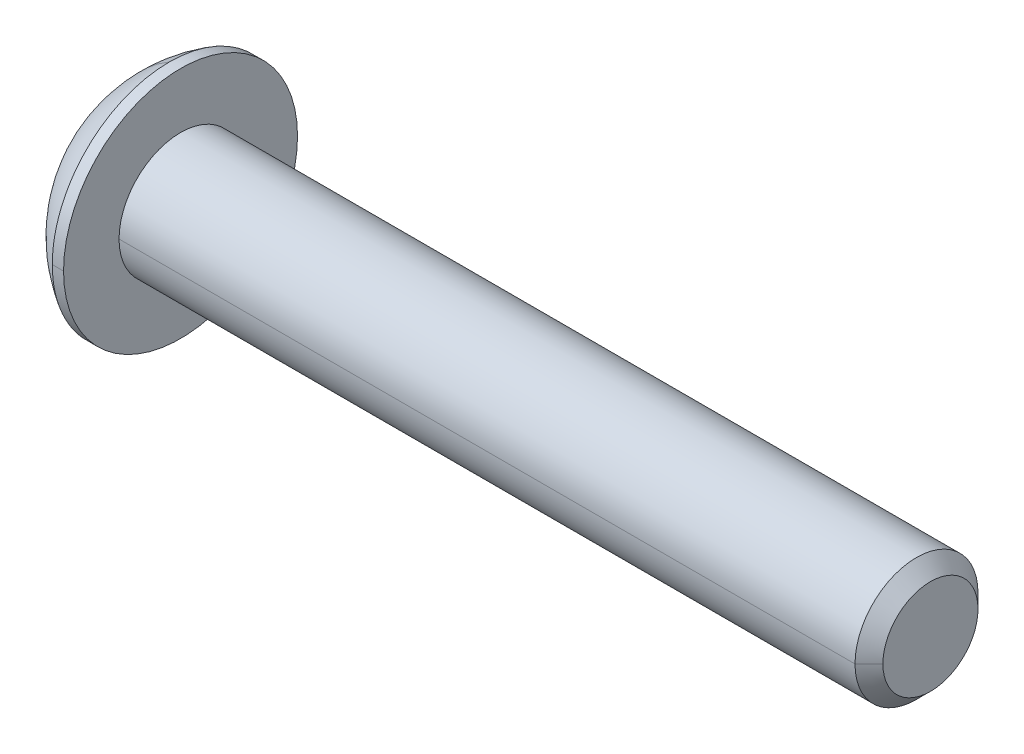
ISO-10303-21;
HEADER;
FILE_DESCRIPTION(('STEP AP214'),'2;1');
FILE_NAME('part.step','',(''),(''),'','','');
FILE_SCHEMA(('AUTOMOTIVE_DESIGN { 1 0 10303 214 1 1 1 1 }'));
ENDSEC;
DATA;
#1=APPLICATION_CONTEXT('core data for automotive mechanical design processes');
#2=APPLICATION_PROTOCOL_DEFINITION('international standard','automotive_design',2000,#1);
#3=PRODUCT_CONTEXT('',#1,'mechanical');
#4=PRODUCT('Part','Part','',(#3));
#5=PRODUCT_RELATED_PRODUCT_CATEGORY('part','',(#4));
#6=PRODUCT_DEFINITION_FORMATION('','',#4);
#7=PRODUCT_DEFINITION_CONTEXT('part definition',#1,'design');
#8=PRODUCT_DEFINITION('design','',#6,#7);
#9=PRODUCT_DEFINITION_SHAPE('','',#8);
#10=(LENGTH_UNIT() NAMED_UNIT(*) SI_UNIT(.MILLI.,.METRE.));
#11=(NAMED_UNIT(*) PLANE_ANGLE_UNIT() SI_UNIT($,.RADIAN.));
#12=(NAMED_UNIT(*) SI_UNIT($,.STERADIAN.) SOLID_ANGLE_UNIT());
#13=UNCERTAINTY_MEASURE_WITH_UNIT(LENGTH_MEASURE(1.E-05),#10,'distance_accuracy_value','');
#14=(GEOMETRIC_REPRESENTATION_CONTEXT(3) GLOBAL_UNCERTAINTY_ASSIGNED_CONTEXT((#13)) GLOBAL_UNIT_ASSIGNED_CONTEXT((#10,
#11,#12)) REPRESENTATION_CONTEXT('',''));
#15=CARTESIAN_POINT('',(0.,0.,0.));
#16=DIRECTION('',(0.,0.,1.));
#17=DIRECTION('',(1.,0.,0.));
#18=AXIS2_PLACEMENT_3D('',#15,#16,#17);
#19=CARTESIAN_POINT('',(-997.989959248641,0.,0.));
#20=DIRECTION('',(-1.,0.,0.));
#21=DIRECTION('',(0.,0.,1.));
#22=AXIS2_PLACEMENT_3D('',#19,#20,#21);
#23=CONICAL_SURFACE('',#22,1732.05080756886,1.0471975511966);
#24=DIRECTION('',(-0.5,0.,0.866025403784436));
#25=VECTOR('',#24,1.);
#26=CARTESIAN_POINT('',(2.01004075135859,0.,0.));
#27=LINE('',#26,#25);
#28=CARTESIAN_POINT('',(2.01004075135859,0.,0.));
#29=VERTEX_POINT('',#28);
#30=CARTESIAN_POINT('',(1.3208,0.,1.1938));
#31=VERTEX_POINT('',#30);
#32=EDGE_CURVE('E11',#29,#31,#27,.T.);
#33=ORIENTED_EDGE('',*,*,#32,.F.);
#34=DIRECTION('',(-0.5,0.,-0.866025403784436));
#35=VECTOR('',#34,1.);
#36=CARTESIAN_POINT('',(2.01004075135859,0.,0.));
#37=LINE('',#36,#35);
#38=CARTESIAN_POINT('',(1.3208,0.,-1.1938));
#39=VERTEX_POINT('',#38);
#40=EDGE_CURVE('E27',#29,#39,#37,.T.);
#41=ORIENTED_EDGE('',*,*,#40,.T.);
#42=CARTESIAN_POINT('',(1.3208,0.,0.));
#43=DIRECTION('',(-1.,0.,0.));
#44=DIRECTION('',(0.,0.,1.));
#45=AXIS2_PLACEMENT_3D('',#42,#43,#44);
#46=CIRCLE('',#45,1.1938);
#47=CARTESIAN_POINT('',(1.3208,-1.03386112703786,-0.5969));
#48=VERTEX_POINT('',#47);
#49=EDGE_CURVE('E303',#39,#48,#46,.T.);
#50=ORIENTED_EDGE('',*,*,#49,.T.);
#51=CARTESIAN_POINT('',(1.3208,0.,0.));
#52=DIRECTION('',(-1.,0.,0.));
#53=DIRECTION('',(0.,0.,1.));
#54=AXIS2_PLACEMENT_3D('',#51,#52,#53);
#55=CIRCLE('',#54,1.1938);
#56=CARTESIAN_POINT('',(1.3208,-1.03386112703786,0.5969));
#57=VERTEX_POINT('',#56);
#58=EDGE_CURVE('E206',#48,#57,#55,.T.);
#59=ORIENTED_EDGE('',*,*,#58,.T.);
#60=CARTESIAN_POINT('',(1.3208,0.,0.));
#61=DIRECTION('',(-1.,0.,0.));
#62=DIRECTION('',(0.,0.,1.));
#63=AXIS2_PLACEMENT_3D('',#60,#61,#62);
#64=CIRCLE('',#63,1.1938);
#65=EDGE_CURVE('E238',#57,#31,#64,.T.);
#66=ORIENTED_EDGE('',*,*,#65,.T.);
#67=EDGE_LOOP('',(#33,#41,#50,#59,#66));
#68=FACE_BOUND('',#67,.T.);
#69=ADVANCED_FACE('F16',(#68),#23,.F.);
#70=CARTESIAN_POINT('',(-997.989959248641,0.,0.));
#71=DIRECTION('',(-1.,0.,0.));
#72=DIRECTION('',(0.,0.,1.));
#73=AXIS2_PLACEMENT_3D('',#70,#71,#72);
#74=CONICAL_SURFACE('',#73,1732.05080756886,1.0471975511966);
#75=ORIENTED_EDGE('',*,*,#40,.F.);
#76=ORIENTED_EDGE('',*,*,#32,.T.);
#77=CARTESIAN_POINT('',(1.3208,0.,0.));
#78=DIRECTION('',(-1.,0.,0.));
#79=DIRECTION('',(0.,0.,1.));
#80=AXIS2_PLACEMENT_3D('',#77,#78,#79);
#81=CIRCLE('',#80,1.1938);
#82=CARTESIAN_POINT('',(1.3208,1.03386112703786,0.5969));
#83=VERTEX_POINT('',#82);
#84=EDGE_CURVE('E100',#31,#83,#81,.T.);
#85=ORIENTED_EDGE('',*,*,#84,.T.);
#86=CARTESIAN_POINT('',(1.3208,0.,0.));
#87=DIRECTION('',(-1.,0.,0.));
#88=DIRECTION('',(0.,0.,1.));
#89=AXIS2_PLACEMENT_3D('',#86,#87,#88);
#90=CIRCLE('',#89,1.1938);
#91=CARTESIAN_POINT('',(1.3208,1.03386112703786,-0.5969));
#92=VERTEX_POINT('',#91);
#93=EDGE_CURVE('E210',#83,#92,#90,.T.);
#94=ORIENTED_EDGE('',*,*,#93,.T.);
#95=CARTESIAN_POINT('',(1.3208,0.,0.));
#96=DIRECTION('',(-1.,0.,0.));
#97=DIRECTION('',(0.,0.,1.));
#98=AXIS2_PLACEMENT_3D('',#95,#96,#97);
#99=CIRCLE('',#98,1.1938);
#100=EDGE_CURVE('E307',#92,#39,#99,.T.);
#101=ORIENTED_EDGE('',*,*,#100,.T.);
#102=EDGE_LOOP('',(#75,#76,#85,#94,#101));
#103=FACE_BOUND('',#102,.T.);
#104=ADVANCED_FACE('F386',(#103),#74,.F.);
#105=CARTESIAN_POINT('',(1.3208,-2.06772225407573,-1.1938));
#106=DIRECTION('',(1.,0.,0.));
#107=DIRECTION('',(0.,1.,0.));
#108=AXIS2_PLACEMENT_3D('',#105,#106,#107);
#109=PLANE('',#108);
#110=ORIENTED_EDGE('',*,*,#58,.F.);
#111=DIRECTION('',(0.,0.5,-0.866025403784439));
#112=VECTOR('',#111,1.);
#113=CARTESIAN_POINT('',(1.3208,-0.689240751358574,-1.1938));
#114=LINE('',#113,#112);
#115=CARTESIAN_POINT('',(1.3208,-1.37848150271715,0.));
#116=VERTEX_POINT('',#115);
#117=EDGE_CURVE('E211',#116,#48,#114,.T.);
#118=ORIENTED_EDGE('',*,*,#117,.F.);
#119=DIRECTION('',(0.,-0.5,-0.866025403784439));
#120=VECTOR('',#119,1.);
#121=CARTESIAN_POINT('',(1.3208,-1.37848150271715,0.));
#122=LINE('',#121,#120);
#123=EDGE_CURVE('E231',#57,#116,#122,.T.);
#124=ORIENTED_EDGE('',*,*,#123,.F.);
#125=EDGE_LOOP('',(#110,#118,#124));
#126=FACE_BOUND('',#125,.T.);
#127=ADVANCED_FACE('F688',(#126),#109,.F.);
#128=CARTESIAN_POINT('',(1.3208,-2.06772225407573,-1.1938));
#129=DIRECTION('',(1.,0.,0.));
#130=DIRECTION('',(0.,1.,0.));
#131=AXIS2_PLACEMENT_3D('',#128,#129,#130);
#132=PLANE('',#131);
#133=ORIENTED_EDGE('',*,*,#49,.F.);
#134=DIRECTION('',(0.,1.,0.));
#135=VECTOR('',#134,1.);
#136=CARTESIAN_POINT('',(1.3208,0.689240751358577,-1.1938));
#137=LINE('',#136,#135);
#138=CARTESIAN_POINT('',(1.3208,-0.689240751358574,-1.1938));
#139=VERTEX_POINT('',#138);
#140=EDGE_CURVE('E258',#139,#39,#137,.T.);
#141=ORIENTED_EDGE('',*,*,#140,.F.);
#142=DIRECTION('',(0.,0.5,-0.866025403784439));
#143=VECTOR('',#142,1.);
#144=CARTESIAN_POINT('',(1.3208,-0.689240751358574,-1.1938));
#145=LINE('',#144,#143);
#146=EDGE_CURVE('E208',#48,#139,#145,.T.);
#147=ORIENTED_EDGE('',*,*,#146,.F.);
#148=EDGE_LOOP('',(#133,#141,#147));
#149=FACE_BOUND('',#148,.T.);
#150=ADVANCED_FACE('F407',(#149),#132,.F.);
#151=CARTESIAN_POINT('',(1.3208,-2.06772225407573,-1.1938));
#152=DIRECTION('',(1.,0.,0.));
#153=DIRECTION('',(0.,1.,0.));
#154=AXIS2_PLACEMENT_3D('',#151,#152,#153);
#155=PLANE('',#154);
#156=ORIENTED_EDGE('',*,*,#100,.F.);
#157=DIRECTION('',(0.,0.5,0.866025403784439));
#158=VECTOR('',#157,1.);
#159=CARTESIAN_POINT('',(1.3208,1.37848150271715,0.));
#160=LINE('',#159,#158);
#161=CARTESIAN_POINT('',(1.3208,0.689240751358577,-1.1938));
#162=VERTEX_POINT('',#161);
#163=EDGE_CURVE('E298',#162,#92,#160,.T.);
#164=ORIENTED_EDGE('',*,*,#163,.F.);
#165=DIRECTION('',(0.,1.,0.));
#166=VECTOR('',#165,1.);
#167=CARTESIAN_POINT('',(1.3208,0.689240751358577,-1.1938));
#168=LINE('',#167,#166);
#169=EDGE_CURVE('E255',#39,#162,#168,.T.);
#170=ORIENTED_EDGE('',*,*,#169,.F.);
#171=EDGE_LOOP('',(#156,#164,#170));
#172=FACE_BOUND('',#171,.T.);
#173=ADVANCED_FACE('F385',(#172),#155,.F.);
#174=CARTESIAN_POINT('',(1.3208,-2.06772225407573,-1.1938));
#175=DIRECTION('',(1.,0.,0.));
#176=DIRECTION('',(0.,1.,0.));
#177=AXIS2_PLACEMENT_3D('',#174,#175,#176);
#178=PLANE('',#177);
#179=ORIENTED_EDGE('',*,*,#65,.F.);
#180=DIRECTION('',(0.,-0.5,-0.866025403784439));
#181=VECTOR('',#180,1.);
#182=CARTESIAN_POINT('',(1.3208,-1.37848150271715,0.));
#183=LINE('',#182,#181);
#184=CARTESIAN_POINT('',(1.3208,-0.689240751358574,1.1938));
#185=VERTEX_POINT('',#184);
#186=EDGE_CURVE('E236',#185,#57,#183,.T.);
#187=ORIENTED_EDGE('',*,*,#186,.F.);
#188=DIRECTION('',(0.,-1.,0.));
#189=VECTOR('',#188,1.);
#190=CARTESIAN_POINT('',(1.3208,-0.689240751358574,1.1938));
#191=LINE('',#190,#189);
#192=EDGE_CURVE('E259',#31,#185,#191,.T.);
#193=ORIENTED_EDGE('',*,*,#192,.F.);
#194=EDGE_LOOP('',(#179,#187,#193));
#195=FACE_BOUND('',#194,.T.);
#196=ADVANCED_FACE('F417',(#195),#178,.F.);
#197=CARTESIAN_POINT('',(1.3208,-2.06772225407573,-1.1938));
#198=DIRECTION('',(1.,0.,0.));
#199=DIRECTION('',(0.,1.,0.));
#200=AXIS2_PLACEMENT_3D('',#197,#198,#199);
#201=PLANE('',#200);
#202=ORIENTED_EDGE('',*,*,#84,.F.);
#203=DIRECTION('',(0.,-1.,0.));
#204=VECTOR('',#203,1.);
#205=CARTESIAN_POINT('',(1.3208,-0.689240751358574,1.1938));
#206=LINE('',#205,#204);
#207=CARTESIAN_POINT('',(1.3208,0.689240751358576,1.1938));
#208=VERTEX_POINT('',#207);
#209=EDGE_CURVE('E264',#208,#31,#206,.T.);
#210=ORIENTED_EDGE('',*,*,#209,.F.);
#211=DIRECTION('',(0.,-0.5,0.866025403784439));
#212=VECTOR('',#211,1.);
#213=CARTESIAN_POINT('',(1.3208,0.689240751358576,1.1938));
#214=LINE('',#213,#212);
#215=EDGE_CURVE('E218',#83,#208,#214,.T.);
#216=ORIENTED_EDGE('',*,*,#215,.F.);
#217=EDGE_LOOP('',(#202,#210,#216));
#218=FACE_BOUND('',#217,.T.);
#219=ADVANCED_FACE('F18',(#218),#201,.F.);
#220=CARTESIAN_POINT('',(1.3208,-2.06772225407573,-1.1938));
#221=DIRECTION('',(1.,0.,0.));
#222=DIRECTION('',(0.,1.,0.));
#223=AXIS2_PLACEMENT_3D('',#220,#221,#222);
#224=PLANE('',#223);
#225=ORIENTED_EDGE('',*,*,#93,.F.);
#226=DIRECTION('',(0.,-0.5,0.866025403784439));
#227=VECTOR('',#226,1.);
#228=CARTESIAN_POINT('',(1.3208,0.689240751358576,1.1938));
#229=LINE('',#228,#227);
#230=CARTESIAN_POINT('',(1.3208,1.37848150271715,0.));
#231=VERTEX_POINT('',#230);
#232=EDGE_CURVE('E219',#231,#83,#229,.T.);
#233=ORIENTED_EDGE('',*,*,#232,.F.);
#234=DIRECTION('',(0.,0.5,0.866025403784439));
#235=VECTOR('',#234,1.);
#236=CARTESIAN_POINT('',(1.3208,1.37848150271715,0.));
#237=LINE('',#236,#235);
#238=EDGE_CURVE('E116',#92,#231,#237,.T.);
#239=ORIENTED_EDGE('',*,*,#238,.F.);
#240=EDGE_LOOP('',(#225,#233,#239));
#241=FACE_BOUND('',#240,.T.);
#242=ADVANCED_FACE('F390',(#241),#224,.F.);
#243=CARTESIAN_POINT('',(1.3208,-0.689240751358574,-1.1938));
#244=DIRECTION('',(0.,0.866025403784439,0.5));
#245=DIRECTION('',(1.,0.,0.));
#246=AXIS2_PLACEMENT_3D('',#243,#244,#245);
#247=PLANE('',#246);
#248=ORIENTED_EDGE('',*,*,#117,.T.);
#249=ORIENTED_EDGE('',*,*,#146,.T.);
#250=DIRECTION('',(-1.,0.,0.));
#251=VECTOR('',#250,1.);
#252=CARTESIAN_POINT('',(1.3208,-0.689240751358574,-1.1938));
#253=LINE('',#252,#251);
#254=CARTESIAN_POINT('',(0.,-0.689240751358574,-1.1938));
#255=VERTEX_POINT('',#254);
#256=EDGE_CURVE('E243',#139,#255,#253,.T.);
#257=ORIENTED_EDGE('',*,*,#256,.T.);
#258=DIRECTION('',(0.,0.5,-0.866025403784439));
#259=VECTOR('',#258,1.);
#260=CARTESIAN_POINT('',(0.,-0.689240751358574,-1.1938));
#261=LINE('',#260,#259);
#262=CARTESIAN_POINT('',(0.,-1.37848150271715,0.));
#263=VERTEX_POINT('',#262);
#264=EDGE_CURVE('E331',#263,#255,#261,.T.);
#265=ORIENTED_EDGE('',*,*,#264,.F.);
#266=DIRECTION('',(-1.,0.,0.));
#267=VECTOR('',#266,1.);
#268=CARTESIAN_POINT('',(1.3208,-1.37848150271715,0.));
#269=LINE('',#268,#267);
#270=EDGE_CURVE('E235',#116,#263,#269,.T.);
#271=ORIENTED_EDGE('',*,*,#270,.F.);
#272=EDGE_LOOP('',(#248,#249,#257,#265,#271));
#273=FACE_BOUND('',#272,.T.);
#274=ADVANCED_FACE('F658',(#273),#247,.T.);
#275=CARTESIAN_POINT('',(1.3208,-1.37848150271715,0.));
#276=DIRECTION('',(0.,0.866025403784439,-0.5));
#277=DIRECTION('',(-1.,0.,0.));
#278=AXIS2_PLACEMENT_3D('',#275,#276,#277);
#279=PLANE('',#278);
#280=ORIENTED_EDGE('',*,*,#186,.T.);
#281=ORIENTED_EDGE('',*,*,#123,.T.);
#282=ORIENTED_EDGE('',*,*,#270,.T.);
#283=DIRECTION('',(0.,-0.5,-0.866025403784439));
#284=VECTOR('',#283,1.);
#285=CARTESIAN_POINT('',(0.,-1.37848150271715,0.));
#286=LINE('',#285,#284);
#287=CARTESIAN_POINT('',(0.,-0.689240751358574,1.1938));
#288=VERTEX_POINT('',#287);
#289=EDGE_CURVE('E230',#288,#263,#286,.T.);
#290=ORIENTED_EDGE('',*,*,#289,.F.);
#291=DIRECTION('',(-1.,0.,0.));
#292=VECTOR('',#291,1.);
#293=CARTESIAN_POINT('',(1.3208,-0.689240751358574,1.1938));
#294=LINE('',#293,#292);
#295=EDGE_CURVE('E263',#185,#288,#294,.T.);
#296=ORIENTED_EDGE('',*,*,#295,.F.);
#297=EDGE_LOOP('',(#280,#281,#282,#290,#296));
#298=FACE_BOUND('',#297,.T.);
#299=ADVANCED_FACE('F427',(#298),#279,.T.);
#300=CARTESIAN_POINT('',(1.3208,0.689240751358577,-1.1938));
#301=DIRECTION('',(0.,0.,1.));
#302=DIRECTION('',(1.,0.,0.));
#303=AXIS2_PLACEMENT_3D('',#300,#301,#302);
#304=PLANE('',#303);
#305=ORIENTED_EDGE('',*,*,#140,.T.);
#306=ORIENTED_EDGE('',*,*,#169,.T.);
#307=DIRECTION('',(-1.,0.,0.));
#308=VECTOR('',#307,1.);
#309=CARTESIAN_POINT('',(1.3208,0.689240751358577,-1.1938));
#310=LINE('',#309,#308);
#311=CARTESIAN_POINT('',(0.,0.689240751358577,-1.1938));
#312=VERTEX_POINT('',#311);
#313=EDGE_CURVE('E321',#162,#312,#310,.T.);
#314=ORIENTED_EDGE('',*,*,#313,.T.);
#315=DIRECTION('',(0.,1.,0.));
#316=VECTOR('',#315,1.);
#317=CARTESIAN_POINT('',(0.,0.689240751358577,-1.1938));
#318=LINE('',#317,#316);
#319=EDGE_CURVE('E302',#255,#312,#318,.T.);
#320=ORIENTED_EDGE('',*,*,#319,.F.);
#321=ORIENTED_EDGE('',*,*,#256,.F.);
#322=EDGE_LOOP('',(#305,#306,#314,#320,#321));
#323=FACE_BOUND('',#322,.T.);
#324=ADVANCED_FACE('F400',(#323),#304,.T.);
#325=CARTESIAN_POINT('',(1.3208,1.37848150271715,0.));
#326=DIRECTION('',(0.,-0.866025403784439,0.5));
#327=DIRECTION('',(-1.,0.,0.));
#328=AXIS2_PLACEMENT_3D('',#325,#326,#327);
#329=PLANE('',#328);
#330=ORIENTED_EDGE('',*,*,#163,.T.);
#331=ORIENTED_EDGE('',*,*,#238,.T.);
#332=DIRECTION('',(-1.,0.,0.));
#333=VECTOR('',#332,1.);
#334=CARTESIAN_POINT('',(1.3208,1.37848150271715,0.));
#335=LINE('',#334,#333);
#336=CARTESIAN_POINT('',(0.,1.37848150271715,0.));
#337=VERTEX_POINT('',#336);
#338=EDGE_CURVE('E217',#231,#337,#335,.T.);
#339=ORIENTED_EDGE('',*,*,#338,.T.);
#340=DIRECTION('',(0.,0.5,0.866025403784439));
#341=VECTOR('',#340,1.);
#342=CARTESIAN_POINT('',(0.,1.37848150271715,0.));
#343=LINE('',#342,#341);
#344=EDGE_CURVE('E268',#312,#337,#343,.T.);
#345=ORIENTED_EDGE('',*,*,#344,.F.);
#346=ORIENTED_EDGE('',*,*,#313,.F.);
#347=EDGE_LOOP('',(#330,#331,#339,#345,#346));
#348=FACE_BOUND('',#347,.T.);
#349=ADVANCED_FACE('F381',(#348),#329,.T.);
#350=CARTESIAN_POINT('',(1.3208,-0.689240751358574,1.1938));
#351=DIRECTION('',(0.,0.,-1.));
#352=DIRECTION('',(-1.,0.,0.));
#353=AXIS2_PLACEMENT_3D('',#350,#351,#352);
#354=PLANE('',#353);
#355=ORIENTED_EDGE('',*,*,#209,.T.);
#356=ORIENTED_EDGE('',*,*,#192,.T.);
#357=ORIENTED_EDGE('',*,*,#295,.T.);
#358=DIRECTION('',(0.,-1.,0.));
#359=VECTOR('',#358,1.);
#360=CARTESIAN_POINT('',(0.,-0.689240751358574,1.1938));
#361=LINE('',#360,#359);
#362=CARTESIAN_POINT('',(0.,0.689240751358576,1.1938));
#363=VERTEX_POINT('',#362);
#364=EDGE_CURVE('E183',#363,#288,#361,.T.);
#365=ORIENTED_EDGE('',*,*,#364,.F.);
#366=DIRECTION('',(-1.,0.,0.));
#367=VECTOR('',#366,1.);
#368=CARTESIAN_POINT('',(1.3208,0.689240751358576,1.1938));
#369=LINE('',#368,#367);
#370=EDGE_CURVE('E214',#208,#363,#369,.T.);
#371=ORIENTED_EDGE('',*,*,#370,.F.);
#372=EDGE_LOOP('',(#355,#356,#357,#365,#371));
#373=FACE_BOUND('',#372,.T.);
#374=ADVANCED_FACE('F420',(#373),#354,.T.);
#375=CARTESIAN_POINT('',(1.3208,0.689240751358576,1.1938));
#376=DIRECTION('',(0.,-0.866025403784439,-0.5));
#377=DIRECTION('',(0.,0.5,-0.866025403784439));
#378=AXIS2_PLACEMENT_3D('',#375,#376,#377);
#379=PLANE('',#378);
#380=ORIENTED_EDGE('',*,*,#232,.T.);
#381=ORIENTED_EDGE('',*,*,#215,.T.);
#382=ORIENTED_EDGE('',*,*,#370,.T.);
#383=DIRECTION('',(0.,-0.5,0.866025403784439));
#384=VECTOR('',#383,1.);
#385=CARTESIAN_POINT('',(0.,0.689240751358576,1.1938));
#386=LINE('',#385,#384);
#387=EDGE_CURVE('E223',#337,#363,#386,.T.);
#388=ORIENTED_EDGE('',*,*,#387,.F.);
#389=ORIENTED_EDGE('',*,*,#338,.F.);
#390=EDGE_LOOP('',(#380,#381,#382,#388,#389));
#391=FACE_BOUND('',#390,.T.);
#392=ADVANCED_FACE('F392',(#391),#379,.T.);
#393=CARTESIAN_POINT('',(0.,0.,0.));
#394=DIRECTION('',(-1.,0.,0.));
#395=DIRECTION('',(0.,0.,1.));
#396=AXIS2_PLACEMENT_3D('',#393,#394,#395);
#397=PLANE('',#396);
#398=ORIENTED_EDGE('',*,*,#364,.T.);
#399=ORIENTED_EDGE('',*,*,#289,.T.);
#400=ORIENTED_EDGE('',*,*,#264,.T.);
#401=ORIENTED_EDGE('',*,*,#319,.T.);
#402=ORIENTED_EDGE('',*,*,#344,.T.);
#403=ORIENTED_EDGE('',*,*,#387,.T.);
#404=EDGE_LOOP('',(#398,#399,#400,#401,#402,#403));
#405=FACE_BOUND('',#404,.T.);
#406=CARTESIAN_POINT('',(0.,0.,0.));
#407=DIRECTION('',(-1.,0.,0.));
#408=DIRECTION('',(0.,0.,1.));
#409=AXIS2_PLACEMENT_3D('',#406,#407,#408);
#410=CIRCLE('',#409,1.9812);
#411=CARTESIAN_POINT('',(0.,1.9812,0.));
#412=VERTEX_POINT('',#411);
#413=CARTESIAN_POINT('',(0.,-1.9812,0.));
#414=VERTEX_POINT('',#413);
#415=EDGE_CURVE('E185',#412,#414,#410,.T.);
#416=ORIENTED_EDGE('',*,*,#415,.T.);
#417=CARTESIAN_POINT('',(0.,0.,0.));
#418=DIRECTION('',(-1.,0.,0.));
#419=DIRECTION('',(0.,0.,1.));
#420=AXIS2_PLACEMENT_3D('',#417,#418,#419);
#421=CIRCLE('',#420,1.9812);
#422=EDGE_CURVE('E171',#414,#412,#421,.T.);
#423=ORIENTED_EDGE('',*,*,#422,.T.);
#424=EDGE_LOOP('',(#416,#423));
#425=FACE_BOUND('',#424,.T.);
#426=ADVANCED_FACE('F186',(#405,#425),#397,.T.);
#427=CARTESIAN_POINT('',(4.13385,0.,0.));
#428=DIRECTION('',(0.,0.,-1.));
#429=DIRECTION('',(0.,1.,0.));
#430=AXIS2_PLACEMENT_3D('',#427,#428,#429);
#431=SPHERICAL_SURFACE('',#430,4.58408870578439);
#432=CARTESIAN_POINT('',(4.13385,0.,0.));
#433=DIRECTION('',(0.,0.,-1.));
#434=DIRECTION('',(0.,1.,0.));
#435=AXIS2_PLACEMENT_3D('',#432,#433,#434);
#436=CIRCLE('',#435,4.58408870578439);
#437=CARTESIAN_POINT('',(1.8288,-3.9624,0.));
#438=VERTEX_POINT('',#437);
#439=EDGE_CURVE('E176',#438,#414,#436,.T.);
#440=ORIENTED_EDGE('',*,*,#439,.F.);
#441=CARTESIAN_POINT('',(1.8288,0.,0.));
#442=DIRECTION('',(-1.,0.,0.));
#443=DIRECTION('',(0.,0.,1.));
#444=AXIS2_PLACEMENT_3D('',#441,#442,#443);
#445=CIRCLE('',#444,3.9624);
#446=CARTESIAN_POINT('',(1.8288,0.,3.9624));
#447=VERTEX_POINT('',#446);
#448=EDGE_CURVE('E226',#438,#447,#445,.T.);
#449=ORIENTED_EDGE('',*,*,#448,.T.);
#450=CARTESIAN_POINT('',(1.8288,0.,0.));
#451=DIRECTION('',(-1.,0.,0.));
#452=DIRECTION('',(0.,0.,1.));
#453=AXIS2_PLACEMENT_3D('',#450,#451,#452);
#454=CIRCLE('',#453,3.9624);
#455=CARTESIAN_POINT('',(1.8288,3.9624,0.));
#456=VERTEX_POINT('',#455);
#457=EDGE_CURVE('E195',#447,#456,#454,.T.);
#458=ORIENTED_EDGE('',*,*,#457,.T.);
#459=CARTESIAN_POINT('',(4.13385,0.,0.));
#460=DIRECTION('',(0.,0.,1.));
#461=DIRECTION('',(1.,0.,0.));
#462=AXIS2_PLACEMENT_3D('',#459,#460,#461);
#463=CIRCLE('',#462,4.58408870578439);
#464=EDGE_CURVE('E179',#456,#412,#463,.T.);
#465=ORIENTED_EDGE('',*,*,#464,.T.);
#466=ORIENTED_EDGE('',*,*,#422,.F.);
#467=EDGE_LOOP('',(#440,#449,#458,#465,#466));
#468=FACE_BOUND('',#467,.T.);
#469=ADVANCED_FACE('F173',(#468),#431,.T.);
#470=CARTESIAN_POINT('',(4.13385,0.,0.));
#471=DIRECTION('',(0.,0.,-1.));
#472=DIRECTION('',(0.,1.,0.));
#473=AXIS2_PLACEMENT_3D('',#470,#471,#472);
#474=SPHERICAL_SURFACE('',#473,4.58408870578439);
#475=CARTESIAN_POINT('',(1.8288,0.,0.));
#476=DIRECTION('',(-1.,0.,0.));
#477=DIRECTION('',(0.,0.,1.));
#478=AXIS2_PLACEMENT_3D('',#475,#476,#477);
#479=CIRCLE('',#478,3.9624);
#480=CARTESIAN_POINT('',(1.8288,0.,-3.9624));
#481=VERTEX_POINT('',#480);
#482=EDGE_CURVE('E202',#456,#481,#479,.T.);
#483=ORIENTED_EDGE('',*,*,#482,.T.);
#484=CARTESIAN_POINT('',(1.8288,0.,0.));
#485=DIRECTION('',(-1.,0.,0.));
#486=DIRECTION('',(0.,0.,1.));
#487=AXIS2_PLACEMENT_3D('',#484,#485,#486);
#488=CIRCLE('',#487,3.9624);
#489=EDGE_CURVE('E192',#481,#438,#488,.T.);
#490=ORIENTED_EDGE('',*,*,#489,.T.);
#491=ORIENTED_EDGE('',*,*,#439,.T.);
#492=ORIENTED_EDGE('',*,*,#415,.F.);
#493=ORIENTED_EDGE('',*,*,#464,.F.);
#494=EDGE_LOOP('',(#483,#490,#491,#492,#493));
#495=FACE_BOUND('',#494,.T.);
#496=ADVANCED_FACE('F190',(#495),#474,.T.);
#497=CARTESIAN_POINT('',(0.,0.,0.));
#498=DIRECTION('',(-1.,0.,0.));
#499=DIRECTION('',(0.,0.,1.));
#500=AXIS2_PLACEMENT_3D('',#497,#498,#499);
#501=CYLINDRICAL_SURFACE('',#500,3.9624);
#502=CARTESIAN_POINT('',(2.2098,0.,0.));
#503=DIRECTION('',(-1.,0.,0.));
#504=DIRECTION('',(0.,0.,1.));
#505=AXIS2_PLACEMENT_3D('',#502,#503,#504);
#506=CIRCLE('',#505,3.9624);
#507=CARTESIAN_POINT('',(2.2098,0.,3.9624));
#508=VERTEX_POINT('',#507);
#509=CARTESIAN_POINT('',(2.2098,0.,-3.9624));
#510=VERTEX_POINT('',#509);
#511=EDGE_CURVE('E254',#508,#510,#506,.T.);
#512=ORIENTED_EDGE('',*,*,#511,.T.);
#513=DIRECTION('',(-1.,0.,0.));
#514=VECTOR('',#513,1.);
#515=CARTESIAN_POINT('',(0.,0.,-3.9624));
#516=LINE('',#515,#514);
#517=EDGE_CURVE('E253',#510,#481,#516,.T.);
#518=ORIENTED_EDGE('',*,*,#517,.T.);
#519=ORIENTED_EDGE('',*,*,#482,.F.);
#520=ORIENTED_EDGE('',*,*,#457,.F.);
#521=DIRECTION('',(-1.,0.,0.));
#522=VECTOR('',#521,1.);
#523=CARTESIAN_POINT('',(0.,0.,3.9624));
#524=LINE('',#523,#522);
#525=EDGE_CURVE('E20',#508,#447,#524,.T.);
#526=ORIENTED_EDGE('',*,*,#525,.F.);
#527=EDGE_LOOP('',(#512,#518,#519,#520,#526));
#528=FACE_BOUND('',#527,.T.);
#529=ADVANCED_FACE('F596',(#528),#501,.T.);
#530=CARTESIAN_POINT('',(0.,0.,0.));
#531=DIRECTION('',(-1.,0.,0.));
#532=DIRECTION('',(0.,0.,1.));
#533=AXIS2_PLACEMENT_3D('',#530,#531,#532);
#534=CYLINDRICAL_SURFACE('',#533,3.9624);
#535=ORIENTED_EDGE('',*,*,#517,.F.);
#536=CARTESIAN_POINT('',(2.2098,0.,0.));
#537=DIRECTION('',(-1.,0.,0.));
#538=DIRECTION('',(0.,0.,1.));
#539=AXIS2_PLACEMENT_3D('',#536,#537,#538);
#540=CIRCLE('',#539,3.9624);
#541=EDGE_CURVE('E249',#510,#508,#540,.T.);
#542=ORIENTED_EDGE('',*,*,#541,.T.);
#543=ORIENTED_EDGE('',*,*,#525,.T.);
#544=ORIENTED_EDGE('',*,*,#448,.F.);
#545=ORIENTED_EDGE('',*,*,#489,.F.);
#546=EDGE_LOOP('',(#535,#542,#543,#544,#545));
#547=FACE_BOUND('',#546,.T.);
#548=ADVANCED_FACE('F600',(#547),#534,.T.);
#549=CARTESIAN_POINT('',(2.2098,2.0828,0.));
#550=DIRECTION('',(-1.,0.,0.));
#551=DIRECTION('',(0.,0.,1.));
#552=AXIS2_PLACEMENT_3D('',#549,#550,#551);
#553=PLANE('',#552);
#554=CARTESIAN_POINT('',(2.2098,0.,0.));
#555=DIRECTION('',(-1.,0.,0.));
#556=DIRECTION('',(0.,0.,1.));
#557=AXIS2_PLACEMENT_3D('',#554,#555,#556);
#558=CIRCLE('',#557,2.0828);
#559=CARTESIAN_POINT('',(2.2098,0.,2.0828));
#560=VERTEX_POINT('',#559);
#561=CARTESIAN_POINT('',(2.2098,0.,-2.0828));
#562=VERTEX_POINT('',#561);
#563=EDGE_CURVE('E274',#560,#562,#558,.T.);
#564=ORIENTED_EDGE('',*,*,#563,.T.);
#565=CARTESIAN_POINT('',(2.2098,0.,0.));
#566=DIRECTION('',(-1.,0.,0.));
#567=DIRECTION('',(0.,0.,1.));
#568=AXIS2_PLACEMENT_3D('',#565,#566,#567);
#569=CIRCLE('',#568,2.0828);
#570=EDGE_CURVE('E275',#562,#560,#569,.T.);
#571=ORIENTED_EDGE('',*,*,#570,.T.);
#572=EDGE_LOOP('',(#564,#571));
#573=FACE_BOUND('',#572,.T.);
#574=ORIENTED_EDGE('',*,*,#511,.F.);
#575=ORIENTED_EDGE('',*,*,#541,.F.);
#576=EDGE_LOOP('',(#574,#575));
#577=FACE_BOUND('',#576,.T.);
#578=ADVANCED_FACE('F615',(#573,#577),#553,.F.);
#579=CARTESIAN_POINT('',(0.,0.,0.));
#580=DIRECTION('',(-1.,0.,0.));
#581=DIRECTION('',(0.,0.,1.));
#582=AXIS2_PLACEMENT_3D('',#579,#580,#581);
#583=CYLINDRICAL_SURFACE('',#582,2.0828);
#584=CARTESIAN_POINT('',(27.13736,0.,0.));
#585=DIRECTION('',(-1.,0.,0.));
#586=DIRECTION('',(0.,0.,1.));
#587=AXIS2_PLACEMENT_3D('',#584,#585,#586);
#588=CIRCLE('',#587,2.0828);
#589=CARTESIAN_POINT('',(27.13736,0.,2.0828));
#590=VERTEX_POINT('',#589);
#591=CARTESIAN_POINT('',(27.13736,0.,-2.0828));
#592=VERTEX_POINT('',#591);
#593=EDGE_CURVE('E287',#590,#592,#588,.T.);
#594=ORIENTED_EDGE('',*,*,#593,.T.);
#595=DIRECTION('',(-1.,0.,0.));
#596=VECTOR('',#595,1.);
#597=CARTESIAN_POINT('',(0.,0.,-2.0828));
#598=LINE('',#597,#596);
#599=EDGE_CURVE('E283',#592,#562,#598,.T.);
#600=ORIENTED_EDGE('',*,*,#599,.T.);
#601=ORIENTED_EDGE('',*,*,#563,.F.);
#602=DIRECTION('',(-1.,0.,0.));
#603=VECTOR('',#602,1.);
#604=CARTESIAN_POINT('',(0.,0.,2.0828));
#605=LINE('',#604,#603);
#606=EDGE_CURVE('E279',#590,#560,#605,.T.);
#607=ORIENTED_EDGE('',*,*,#606,.F.);
#608=EDGE_LOOP('',(#594,#600,#601,#607));
#609=FACE_BOUND('',#608,.T.);
#610=ADVANCED_FACE('F625',(#609),#583,.T.);
#611=CARTESIAN_POINT('',(0.,0.,0.));
#612=DIRECTION('',(-1.,0.,0.));
#613=DIRECTION('',(0.,0.,1.));
#614=AXIS2_PLACEMENT_3D('',#611,#612,#613);
#615=CYLINDRICAL_SURFACE('',#614,2.0828);
#616=ORIENTED_EDGE('',*,*,#599,.F.);
#617=CARTESIAN_POINT('',(27.13736,0.,0.));
#618=DIRECTION('',(-1.,0.,0.));
#619=DIRECTION('',(0.,0.,1.));
#620=AXIS2_PLACEMENT_3D('',#617,#618,#619);
#621=CIRCLE('',#620,2.0828);
#622=EDGE_CURVE('E291',#592,#590,#621,.T.);
#623=ORIENTED_EDGE('',*,*,#622,.T.);
#624=ORIENTED_EDGE('',*,*,#606,.T.);
#625=ORIENTED_EDGE('',*,*,#570,.F.);
#626=EDGE_LOOP('',(#616,#623,#624,#625));
#627=FACE_BOUND('',#626,.T.);
#628=ADVANCED_FACE('F620',(#627),#615,.T.);
#629=CARTESIAN_POINT('',(27.6098,0.,0.));
#630=DIRECTION('',(-1.,0.,0.));
#631=DIRECTION('',(0.,0.,1.));
#632=AXIS2_PLACEMENT_3D('',#629,#630,#631);
#633=CONICAL_SURFACE('',#632,1.61036,0.785398163397444);
#634=CARTESIAN_POINT('',(27.6098,0.,0.));
#635=DIRECTION('',(-1.,0.,0.));
#636=DIRECTION('',(0.,0.,1.));
#637=AXIS2_PLACEMENT_3D('',#634,#635,#636);
#638=CIRCLE('',#637,1.61036);
#639=CARTESIAN_POINT('',(27.6098,0.,1.61036));
#640=VERTEX_POINT('',#639);
#641=CARTESIAN_POINT('',(27.6098,0.,-1.61036));
#642=VERTEX_POINT('',#641);
#643=EDGE_CURVE('E244',#640,#642,#638,.T.);
#644=ORIENTED_EDGE('',*,*,#643,.T.);
#645=DIRECTION('',(-0.707106781186551,0.,-0.707106781186545));
#646=VECTOR('',#645,1.);
#647=CARTESIAN_POINT('',(27.6098,0.,-1.61036));
#648=LINE('',#647,#646);
#649=EDGE_CURVE('E311',#642,#592,#648,.T.);
#650=ORIENTED_EDGE('',*,*,#649,.T.);
#651=ORIENTED_EDGE('',*,*,#593,.F.);
#652=DIRECTION('',(-0.707106781186551,0.,0.707106781186545));
#653=VECTOR('',#652,1.);
#654=CARTESIAN_POINT('',(27.6098,0.,1.61036));
#655=LINE('',#654,#653);
#656=EDGE_CURVE('E315',#640,#590,#655,.T.);
#657=ORIENTED_EDGE('',*,*,#656,.F.);
#658=EDGE_LOOP('',(#644,#650,#651,#657));
#659=FACE_BOUND('',#658,.T.);
#660=ADVANCED_FACE('F624',(#659),#633,.T.);
#661=CARTESIAN_POINT('',(27.6098,0.,0.));
#662=DIRECTION('',(-1.,0.,0.));
#663=DIRECTION('',(0.,0.,1.));
#664=AXIS2_PLACEMENT_3D('',#661,#662,#663);
#665=CONICAL_SURFACE('',#664,1.61036,0.785398163397444);
#666=ORIENTED_EDGE('',*,*,#649,.F.);
#667=CARTESIAN_POINT('',(27.6098,0.,0.));
#668=DIRECTION('',(-1.,0.,0.));
#669=DIRECTION('',(0.,0.,1.));
#670=AXIS2_PLACEMENT_3D('',#667,#668,#669);
#671=CIRCLE('',#670,1.61036);
#672=EDGE_CURVE('E248',#642,#640,#671,.T.);
#673=ORIENTED_EDGE('',*,*,#672,.T.);
#674=ORIENTED_EDGE('',*,*,#656,.T.);
#675=ORIENTED_EDGE('',*,*,#622,.F.);
#676=EDGE_LOOP('',(#666,#673,#674,#675));
#677=FACE_BOUND('',#676,.T.);
#678=ADVANCED_FACE('F631',(#677),#665,.T.);
#679=CARTESIAN_POINT('',(27.6098,0.,0.));
#680=DIRECTION('',(-1.,0.,0.));
#681=DIRECTION('',(0.,0.,1.));
#682=AXIS2_PLACEMENT_3D('',#679,#680,#681);
#683=PLANE('',#682);
#684=ORIENTED_EDGE('',*,*,#643,.F.);
#685=ORIENTED_EDGE('',*,*,#672,.F.);
#686=EDGE_LOOP('',(#684,#685));
#687=FACE_BOUND('',#686,.T.);
#688=ADVANCED_FACE('F635',(#687),#683,.F.);
#689=CLOSED_SHELL('',(#69,#104,#127,#150,#173,#196,#219,#242,#274,#299,#324,#349,#374,#392,#426,
#469,#496,#529,#548,#578,#610,#628,#660,#678,#688));
#690=MANIFOLD_SOLID_BREP('B1',#689);
#691=ADVANCED_BREP_SHAPE_REPRESENTATION('',(#18,#690),#14);
#692=SHAPE_DEFINITION_REPRESENTATION(#9,#691);
ENDSEC;
END-ISO-10303-21;
